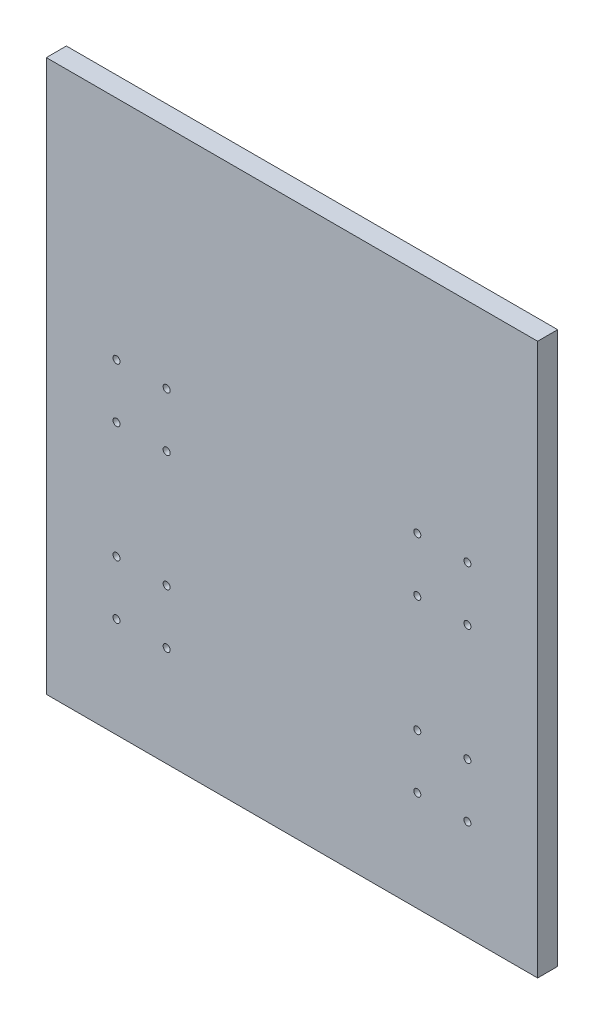
ISO-10303-21;
HEADER;
FILE_DESCRIPTION(('STEP AP214'),'2;1');
FILE_NAME('part.step','',(''),(''),'','','');
FILE_SCHEMA(('AUTOMOTIVE_DESIGN { 1 0 10303 214 1 1 1 1 }'));
ENDSEC;
DATA;
#1=APPLICATION_CONTEXT('core data for automotive mechanical design processes');
#2=APPLICATION_PROTOCOL_DEFINITION('international standard','automotive_design',2000,#1);
#3=PRODUCT_CONTEXT('',#1,'mechanical');
#4=PRODUCT('Part','Part','',(#3));
#5=PRODUCT_RELATED_PRODUCT_CATEGORY('part','',(#4));
#6=PRODUCT_DEFINITION_FORMATION('','',#4);
#7=PRODUCT_DEFINITION_CONTEXT('part definition',#1,'design');
#8=PRODUCT_DEFINITION('design','',#6,#7);
#9=PRODUCT_DEFINITION_SHAPE('','',#8);
#10=(LENGTH_UNIT() NAMED_UNIT(*) SI_UNIT(.MILLI.,.METRE.));
#11=(NAMED_UNIT(*) PLANE_ANGLE_UNIT() SI_UNIT($,.RADIAN.));
#12=(NAMED_UNIT(*) SI_UNIT($,.STERADIAN.) SOLID_ANGLE_UNIT());
#13=UNCERTAINTY_MEASURE_WITH_UNIT(LENGTH_MEASURE(1.E-05),#10,'distance_accuracy_value','');
#14=(GEOMETRIC_REPRESENTATION_CONTEXT(3) GLOBAL_UNCERTAINTY_ASSIGNED_CONTEXT((#13)) GLOBAL_UNIT_ASSIGNED_CONTEXT((#10,
#11,#12)) REPRESENTATION_CONTEXT('',''));
#15=CARTESIAN_POINT('',(0.,0.,0.));
#16=DIRECTION('',(0.,0.,1.));
#17=DIRECTION('',(1.,0.,0.));
#18=AXIS2_PLACEMENT_3D('',#15,#16,#17);
#19=CARTESIAN_POINT('',(245.,0.,20.));
#20=DIRECTION('',(1.,0.,0.));
#21=DIRECTION('',(0.,0.,-1.));
#22=AXIS2_PLACEMENT_3D('',#19,#20,#21);
#23=PLANE('',#22);
#24=DIRECTION('',(0.,-1.,0.));
#25=VECTOR('',#24,1.);
#26=CARTESIAN_POINT('',(245.,0.,0.));
#27=LINE('',#26,#25);
#28=CARTESIAN_POINT('',(245.,275.,0.));
#29=VERTEX_POINT('',#28);
#30=CARTESIAN_POINT('',(245.,-275.,0.));
#31=VERTEX_POINT('',#30);
#32=EDGE_CURVE('E154',#29,#31,#27,.T.);
#33=ORIENTED_EDGE('',*,*,#32,.F.);
#34=DIRECTION('',(0.,0.,-1.));
#35=VECTOR('',#34,1.);
#36=CARTESIAN_POINT('',(245.,275.,20.));
#37=LINE('',#36,#35);
#38=CARTESIAN_POINT('',(245.,275.,20.));
#39=VERTEX_POINT('',#38);
#40=EDGE_CURVE('E11',#39,#29,#37,.T.);
#41=ORIENTED_EDGE('',*,*,#40,.F.);
#42=DIRECTION('',(0.,-1.,0.));
#43=VECTOR('',#42,1.);
#44=CARTESIAN_POINT('',(245.,0.,20.));
#45=LINE('',#44,#43);
#46=CARTESIAN_POINT('',(245.,-275.,20.));
#47=VERTEX_POINT('',#46);
#48=EDGE_CURVE('E99',#39,#47,#45,.T.);
#49=ORIENTED_EDGE('',*,*,#48,.T.);
#50=DIRECTION('',(0.,0.,-1.));
#51=VECTOR('',#50,1.);
#52=CARTESIAN_POINT('',(245.,-275.,20.));
#53=LINE('',#52,#51);
#54=EDGE_CURVE('E77',#47,#31,#53,.T.);
#55=ORIENTED_EDGE('',*,*,#54,.T.);
#56=EDGE_LOOP('',(#33,#41,#49,#55));
#57=FACE_BOUND('',#56,.T.);
#58=ADVANCED_FACE('F37',(#57),#23,.T.);
#59=CARTESIAN_POINT('',(0.,275.,20.));
#60=DIRECTION('',(0.,1.,0.));
#61=DIRECTION('',(-1.,0.,0.));
#62=AXIS2_PLACEMENT_3D('',#59,#60,#61);
#63=PLANE('',#62);
#64=DIRECTION('',(1.,0.,0.));
#65=VECTOR('',#64,1.);
#66=CARTESIAN_POINT('',(0.,275.,0.));
#67=LINE('',#66,#65);
#68=CARTESIAN_POINT('',(-245.,275.,0.));
#69=VERTEX_POINT('',#68);
#70=EDGE_CURVE('E89',#69,#29,#67,.T.);
#71=ORIENTED_EDGE('',*,*,#70,.F.);
#72=DIRECTION('',(0.,0.,-1.));
#73=VECTOR('',#72,1.);
#74=CARTESIAN_POINT('',(-245.,275.,20.));
#75=LINE('',#74,#73);
#76=CARTESIAN_POINT('',(-245.,275.,20.));
#77=VERTEX_POINT('',#76);
#78=EDGE_CURVE('E46',#77,#69,#75,.T.);
#79=ORIENTED_EDGE('',*,*,#78,.F.);
#80=DIRECTION('',(1.,0.,0.));
#81=VECTOR('',#80,1.);
#82=CARTESIAN_POINT('',(0.,275.,20.));
#83=LINE('',#82,#81);
#84=EDGE_CURVE('E87',#77,#39,#83,.T.);
#85=ORIENTED_EDGE('',*,*,#84,.T.);
#86=ORIENTED_EDGE('',*,*,#40,.T.);
#87=EDGE_LOOP('',(#71,#79,#85,#86));
#88=FACE_BOUND('',#87,.T.);
#89=ADVANCED_FACE('F85',(#88),#63,.T.);
#90=CARTESIAN_POINT('',(-245.,0.,20.));
#91=DIRECTION('',(1.,0.,0.));
#92=DIRECTION('',(0.,0.,-1.));
#93=AXIS2_PLACEMENT_3D('',#90,#91,#92);
#94=PLANE('',#93);
#95=DIRECTION('',(0.,-1.,0.));
#96=VECTOR('',#95,1.);
#97=CARTESIAN_POINT('',(-245.,0.,0.));
#98=LINE('',#97,#96);
#99=CARTESIAN_POINT('',(-245.,-275.,0.));
#100=VERTEX_POINT('',#99);
#101=EDGE_CURVE('E157',#69,#100,#98,.T.);
#102=ORIENTED_EDGE('',*,*,#101,.T.);
#103=DIRECTION('',(0.,0.,-1.));
#104=VECTOR('',#103,1.);
#105=CARTESIAN_POINT('',(-245.,-275.,20.));
#106=LINE('',#105,#104);
#107=CARTESIAN_POINT('',(-245.,-275.,20.));
#108=VERTEX_POINT('',#107);
#109=EDGE_CURVE('E92',#108,#100,#106,.T.);
#110=ORIENTED_EDGE('',*,*,#109,.F.);
#111=DIRECTION('',(0.,-1.,0.));
#112=VECTOR('',#111,1.);
#113=CARTESIAN_POINT('',(-245.,0.,20.));
#114=LINE('',#113,#112);
#115=EDGE_CURVE('E94',#77,#108,#114,.T.);
#116=ORIENTED_EDGE('',*,*,#115,.F.);
#117=ORIENTED_EDGE('',*,*,#78,.T.);
#118=EDGE_LOOP('',(#102,#110,#116,#117));
#119=FACE_BOUND('',#118,.T.);
#120=ADVANCED_FACE('F95',(#119),#94,.F.);
#121=CARTESIAN_POINT('',(-175.,-175.,20.));
#122=DIRECTION('',(0.,0.,-1.));
#123=DIRECTION('',(-1.,0.,0.));
#124=AXIS2_PLACEMENT_3D('',#121,#122,#123);
#125=CYLINDRICAL_SURFACE('',#124,3.49999999999999);
#126=CARTESIAN_POINT('',(-175.,-175.,20.));
#127=DIRECTION('',(0.,0.,1.));
#128=DIRECTION('',(1.,0.,0.));
#129=AXIS2_PLACEMENT_3D('',#126,#127,#128);
#130=CIRCLE('',#129,3.49999999999999);
#131=CARTESIAN_POINT('',(-171.5,-175.,20.));
#132=VERTEX_POINT('',#131);
#133=EDGE_CURVE('E112',#132,#132,#130,.F.);
#134=ORIENTED_EDGE('',*,*,#133,.F.);
#135=EDGE_LOOP('',(#134));
#136=FACE_BOUND('',#135,.T.);
#137=CARTESIAN_POINT('',(-175.,-175.,0.));
#138=DIRECTION('',(0.,0.,1.));
#139=DIRECTION('',(1.,0.,0.));
#140=AXIS2_PLACEMENT_3D('',#137,#138,#139);
#141=CIRCLE('',#140,3.49999999999999);
#142=CARTESIAN_POINT('',(-171.5,-175.,0.));
#143=VERTEX_POINT('',#142);
#144=EDGE_CURVE('E166',#143,#143,#141,.F.);
#145=ORIENTED_EDGE('',*,*,#144,.T.);
#146=EDGE_LOOP('',(#145));
#147=FACE_BOUND('',#146,.T.);
#148=ADVANCED_FACE('F281',(#136,#147),#125,.F.);
#149=CARTESIAN_POINT('',(175.,49.,20.));
#150=DIRECTION('',(0.,0.,-1.));
#151=DIRECTION('',(-1.,0.,0.));
#152=AXIS2_PLACEMENT_3D('',#149,#150,#151);
#153=CYLINDRICAL_SURFACE('',#152,3.49999999999999);
#154=CARTESIAN_POINT('',(175.,49.,20.));
#155=DIRECTION('',(0.,0.,1.));
#156=DIRECTION('',(1.,0.,0.));
#157=AXIS2_PLACEMENT_3D('',#154,#155,#156);
#158=CIRCLE('',#157,3.49999999999999);
#159=CARTESIAN_POINT('',(178.5,49.,20.));
#160=VERTEX_POINT('',#159);
#161=EDGE_CURVE('E109',#160,#160,#158,.F.);
#162=ORIENTED_EDGE('',*,*,#161,.F.);
#163=EDGE_LOOP('',(#162));
#164=FACE_BOUND('',#163,.T.);
#165=CARTESIAN_POINT('',(175.,49.,0.));
#166=DIRECTION('',(0.,0.,1.));
#167=DIRECTION('',(1.,0.,0.));
#168=AXIS2_PLACEMENT_3D('',#165,#166,#167);
#169=CIRCLE('',#168,3.49999999999999);
#170=CARTESIAN_POINT('',(178.5,49.,0.));
#171=VERTEX_POINT('',#170);
#172=EDGE_CURVE('E163',#171,#171,#169,.F.);
#173=ORIENTED_EDGE('',*,*,#172,.T.);
#174=EDGE_LOOP('',(#173));
#175=FACE_BOUND('',#174,.T.);
#176=ADVANCED_FACE('F284',(#164,#175),#153,.F.);
#177=CARTESIAN_POINT('',(-125.,49.,20.));
#178=DIRECTION('',(0.,0.,-1.));
#179=DIRECTION('',(-1.,0.,0.));
#180=AXIS2_PLACEMENT_3D('',#177,#178,#179);
#181=CYLINDRICAL_SURFACE('',#180,3.50000000000001);
#182=CARTESIAN_POINT('',(-125.,49.,20.));
#183=DIRECTION('',(0.,0.,1.));
#184=DIRECTION('',(1.,0.,0.));
#185=AXIS2_PLACEMENT_3D('',#182,#183,#184);
#186=CIRCLE('',#185,3.50000000000001);
#187=CARTESIAN_POINT('',(-121.5,49.,20.));
#188=VERTEX_POINT('',#187);
#189=EDGE_CURVE('E106',#188,#188,#186,.F.);
#190=ORIENTED_EDGE('',*,*,#189,.F.);
#191=EDGE_LOOP('',(#190));
#192=FACE_BOUND('',#191,.T.);
#193=CARTESIAN_POINT('',(-125.,49.,0.));
#194=DIRECTION('',(0.,0.,1.));
#195=DIRECTION('',(1.,0.,0.));
#196=AXIS2_PLACEMENT_3D('',#193,#194,#195);
#197=CIRCLE('',#196,3.50000000000001);
#198=CARTESIAN_POINT('',(-121.5,49.,0.));
#199=VERTEX_POINT('',#198);
#200=EDGE_CURVE('E160',#199,#199,#197,.F.);
#201=ORIENTED_EDGE('',*,*,#200,.T.);
#202=EDGE_LOOP('',(#201));
#203=FACE_BOUND('',#202,.T.);
#204=ADVANCED_FACE('F288',(#192,#203),#181,.F.);
#205=CARTESIAN_POINT('',(0.,-275.,20.));
#206=DIRECTION('',(0.,1.,0.));
#207=DIRECTION('',(-1.,0.,0.));
#208=AXIS2_PLACEMENT_3D('',#205,#206,#207);
#209=PLANE('',#208);
#210=DIRECTION('',(1.,0.,0.));
#211=VECTOR('',#210,1.);
#212=CARTESIAN_POINT('',(0.,-275.,0.));
#213=LINE('',#212,#211);
#214=EDGE_CURVE('E70',#100,#31,#213,.T.);
#215=ORIENTED_EDGE('',*,*,#214,.T.);
#216=ORIENTED_EDGE('',*,*,#54,.F.);
#217=DIRECTION('',(1.,0.,0.));
#218=VECTOR('',#217,1.);
#219=CARTESIAN_POINT('',(0.,-275.,20.));
#220=LINE('',#219,#218);
#221=EDGE_CURVE('E54',#108,#47,#220,.T.);
#222=ORIENTED_EDGE('',*,*,#221,.F.);
#223=ORIENTED_EDGE('',*,*,#109,.T.);
#224=EDGE_LOOP('',(#215,#216,#222,#223));
#225=FACE_BOUND('',#224,.T.);
#226=ADVANCED_FACE('F175',(#225),#209,.F.);
#227=CARTESIAN_POINT('',(-175.,49.,20.));
#228=DIRECTION('',(0.,0.,-1.));
#229=DIRECTION('',(-1.,0.,0.));
#230=AXIS2_PLACEMENT_3D('',#227,#228,#229);
#231=CYLINDRICAL_SURFACE('',#230,3.49999999999999);
#232=CARTESIAN_POINT('',(-175.,49.,20.));
#233=DIRECTION('',(0.,0.,1.));
#234=DIRECTION('',(1.,0.,0.));
#235=AXIS2_PLACEMENT_3D('',#232,#233,#234);
#236=CIRCLE('',#235,3.49999999999999);
#237=CARTESIAN_POINT('',(-171.5,49.,20.));
#238=VERTEX_POINT('',#237);
#239=EDGE_CURVE('E101',#238,#238,#236,.T.);
#240=ORIENTED_EDGE('',*,*,#239,.T.);
#241=EDGE_LOOP('',(#240));
#242=FACE_BOUND('',#241,.T.);
#243=CARTESIAN_POINT('',(-175.,49.,0.));
#244=DIRECTION('',(0.,0.,1.));
#245=DIRECTION('',(1.,0.,0.));
#246=AXIS2_PLACEMENT_3D('',#243,#244,#245);
#247=CIRCLE('',#246,3.49999999999999);
#248=CARTESIAN_POINT('',(-171.5,49.,0.));
#249=VERTEX_POINT('',#248);
#250=EDGE_CURVE('E151',#249,#249,#247,.T.);
#251=ORIENTED_EDGE('',*,*,#250,.F.);
#252=EDGE_LOOP('',(#251));
#253=FACE_BOUND('',#252,.T.);
#254=ADVANCED_FACE('F186',(#242,#253),#231,.F.);
#255=CARTESIAN_POINT('',(-175.,-5.,20.));
#256=DIRECTION('',(0.,0.,-1.));
#257=DIRECTION('',(-1.,0.,0.));
#258=AXIS2_PLACEMENT_3D('',#255,#256,#257);
#259=CYLINDRICAL_SURFACE('',#258,3.49999999999999);
#260=CARTESIAN_POINT('',(-175.,-5.,20.));
#261=DIRECTION('',(0.,0.,1.));
#262=DIRECTION('',(1.,0.,0.));
#263=AXIS2_PLACEMENT_3D('',#260,#261,#262);
#264=CIRCLE('',#263,3.49999999999999);
#265=CARTESIAN_POINT('',(-171.5,-5.,20.));
#266=VERTEX_POINT('',#265);
#267=EDGE_CURVE('E486',#266,#266,#264,.T.);
#268=ORIENTED_EDGE('',*,*,#267,.T.);
#269=EDGE_LOOP('',(#268));
#270=FACE_BOUND('',#269,.T.);
#271=CARTESIAN_POINT('',(-175.,-5.,0.));
#272=DIRECTION('',(0.,0.,1.));
#273=DIRECTION('',(1.,0.,0.));
#274=AXIS2_PLACEMENT_3D('',#271,#272,#273);
#275=CIRCLE('',#274,3.49999999999999);
#276=CARTESIAN_POINT('',(-171.5,-5.,0.));
#277=VERTEX_POINT('',#276);
#278=EDGE_CURVE('E148',#277,#277,#275,.T.);
#279=ORIENTED_EDGE('',*,*,#278,.F.);
#280=EDGE_LOOP('',(#279));
#281=FACE_BOUND('',#280,.T.);
#282=ADVANCED_FACE('F189',(#270,#281),#259,.F.);
#283=CARTESIAN_POINT('',(-125.,-5.00000000000001,20.));
#284=DIRECTION('',(0.,0.,-1.));
#285=DIRECTION('',(-1.,0.,0.));
#286=AXIS2_PLACEMENT_3D('',#283,#284,#285);
#287=CYLINDRICAL_SURFACE('',#286,3.50000000000001);
#288=CARTESIAN_POINT('',(-125.,-5.00000000000001,20.));
#289=DIRECTION('',(0.,0.,1.));
#290=DIRECTION('',(1.,0.,0.));
#291=AXIS2_PLACEMENT_3D('',#288,#289,#290);
#292=CIRCLE('',#291,3.50000000000001);
#293=CARTESIAN_POINT('',(-121.5,-5.00000000000001,20.));
#294=VERTEX_POINT('',#293);
#295=EDGE_CURVE('E482',#294,#294,#292,.F.);
#296=ORIENTED_EDGE('',*,*,#295,.F.);
#297=EDGE_LOOP('',(#296));
#298=FACE_BOUND('',#297,.T.);
#299=CARTESIAN_POINT('',(-125.,-5.00000000000001,0.));
#300=DIRECTION('',(0.,0.,1.));
#301=DIRECTION('',(1.,0.,0.));
#302=AXIS2_PLACEMENT_3D('',#299,#300,#301);
#303=CIRCLE('',#302,3.50000000000001);
#304=CARTESIAN_POINT('',(-121.5,-5.00000000000001,0.));
#305=VERTEX_POINT('',#304);
#306=EDGE_CURVE('E145',#305,#305,#303,.F.);
#307=ORIENTED_EDGE('',*,*,#306,.T.);
#308=EDGE_LOOP('',(#307));
#309=FACE_BOUND('',#308,.T.);
#310=ADVANCED_FACE('F193',(#298,#309),#287,.F.);
#311=CARTESIAN_POINT('',(125.,49.,20.));
#312=DIRECTION('',(0.,0.,-1.));
#313=DIRECTION('',(-1.,0.,0.));
#314=AXIS2_PLACEMENT_3D('',#311,#312,#313);
#315=CYLINDRICAL_SURFACE('',#314,3.49999999999999);
#316=CARTESIAN_POINT('',(125.,49.,20.));
#317=DIRECTION('',(0.,0.,1.));
#318=DIRECTION('',(1.,0.,0.));
#319=AXIS2_PLACEMENT_3D('',#316,#317,#318);
#320=CIRCLE('',#319,3.49999999999999);
#321=CARTESIAN_POINT('',(128.5,49.,20.));
#322=VERTEX_POINT('',#321);
#323=EDGE_CURVE('E478',#322,#322,#320,.T.);
#324=ORIENTED_EDGE('',*,*,#323,.T.);
#325=EDGE_LOOP('',(#324));
#326=FACE_BOUND('',#325,.T.);
#327=CARTESIAN_POINT('',(125.,49.,0.));
#328=DIRECTION('',(0.,0.,1.));
#329=DIRECTION('',(1.,0.,0.));
#330=AXIS2_PLACEMENT_3D('',#327,#328,#329);
#331=CIRCLE('',#330,3.49999999999999);
#332=CARTESIAN_POINT('',(128.5,49.,0.));
#333=VERTEX_POINT('',#332);
#334=EDGE_CURVE('E142',#333,#333,#331,.T.);
#335=ORIENTED_EDGE('',*,*,#334,.F.);
#336=EDGE_LOOP('',(#335));
#337=FACE_BOUND('',#336,.T.);
#338=ADVANCED_FACE('F197',(#326,#337),#315,.F.);
#339=CARTESIAN_POINT('',(125.,-4.99999999999998,20.));
#340=DIRECTION('',(0.,0.,-1.));
#341=DIRECTION('',(-1.,0.,0.));
#342=AXIS2_PLACEMENT_3D('',#339,#340,#341);
#343=CYLINDRICAL_SURFACE('',#342,3.49999999999999);
#344=CARTESIAN_POINT('',(125.,-4.99999999999998,20.));
#345=DIRECTION('',(0.,0.,1.));
#346=DIRECTION('',(1.,0.,0.));
#347=AXIS2_PLACEMENT_3D('',#344,#345,#346);
#348=CIRCLE('',#347,3.49999999999999);
#349=CARTESIAN_POINT('',(128.5,-4.99999999999998,20.));
#350=VERTEX_POINT('',#349);
#351=EDGE_CURVE('E474',#350,#350,#348,.T.);
#352=ORIENTED_EDGE('',*,*,#351,.T.);
#353=EDGE_LOOP('',(#352));
#354=FACE_BOUND('',#353,.T.);
#355=CARTESIAN_POINT('',(125.,-4.99999999999998,0.));
#356=DIRECTION('',(0.,0.,1.));
#357=DIRECTION('',(1.,0.,0.));
#358=AXIS2_PLACEMENT_3D('',#355,#356,#357);
#359=CIRCLE('',#358,3.49999999999999);
#360=CARTESIAN_POINT('',(128.5,-4.99999999999998,0.));
#361=VERTEX_POINT('',#360);
#362=EDGE_CURVE('E139',#361,#361,#359,.T.);
#363=ORIENTED_EDGE('',*,*,#362,.F.);
#364=EDGE_LOOP('',(#363));
#365=FACE_BOUND('',#364,.T.);
#366=ADVANCED_FACE('F201',(#354,#365),#343,.F.);
#367=CARTESIAN_POINT('',(175.,-4.99999999999996,20.));
#368=DIRECTION('',(0.,0.,-1.));
#369=DIRECTION('',(-1.,0.,0.));
#370=AXIS2_PLACEMENT_3D('',#367,#368,#369);
#371=CYLINDRICAL_SURFACE('',#370,3.49999999999999);
#372=CARTESIAN_POINT('',(175.,-4.99999999999996,20.));
#373=DIRECTION('',(0.,0.,1.));
#374=DIRECTION('',(1.,0.,0.));
#375=AXIS2_PLACEMENT_3D('',#372,#373,#374);
#376=CIRCLE('',#375,3.49999999999999);
#377=CARTESIAN_POINT('',(178.5,-4.99999999999996,20.));
#378=VERTEX_POINT('',#377);
#379=EDGE_CURVE('E470',#378,#378,#376,.F.);
#380=ORIENTED_EDGE('',*,*,#379,.F.);
#381=EDGE_LOOP('',(#380));
#382=FACE_BOUND('',#381,.T.);
#383=CARTESIAN_POINT('',(175.,-4.99999999999996,0.));
#384=DIRECTION('',(0.,0.,1.));
#385=DIRECTION('',(1.,0.,0.));
#386=AXIS2_PLACEMENT_3D('',#383,#384,#385);
#387=CIRCLE('',#386,3.49999999999999);
#388=CARTESIAN_POINT('',(178.5,-4.99999999999996,0.));
#389=VERTEX_POINT('',#388);
#390=EDGE_CURVE('E136',#389,#389,#387,.F.);
#391=ORIENTED_EDGE('',*,*,#390,.T.);
#392=EDGE_LOOP('',(#391));
#393=FACE_BOUND('',#392,.T.);
#394=ADVANCED_FACE('F205',(#382,#393),#371,.F.);
#395=CARTESIAN_POINT('',(-175.,-121.,20.));
#396=DIRECTION('',(0.,0.,-1.));
#397=DIRECTION('',(-1.,0.,0.));
#398=AXIS2_PLACEMENT_3D('',#395,#396,#397);
#399=CYLINDRICAL_SURFACE('',#398,3.49999999999999);
#400=CARTESIAN_POINT('',(-175.,-121.,20.));
#401=DIRECTION('',(0.,0.,1.));
#402=DIRECTION('',(1.,0.,0.));
#403=AXIS2_PLACEMENT_3D('',#400,#401,#402);
#404=CIRCLE('',#403,3.49999999999999);
#405=CARTESIAN_POINT('',(-171.5,-121.,20.));
#406=VERTEX_POINT('',#405);
#407=EDGE_CURVE('E466',#406,#406,#404,.F.);
#408=ORIENTED_EDGE('',*,*,#407,.F.);
#409=EDGE_LOOP('',(#408));
#410=FACE_BOUND('',#409,.T.);
#411=CARTESIAN_POINT('',(-175.,-121.,0.));
#412=DIRECTION('',(0.,0.,1.));
#413=DIRECTION('',(1.,0.,0.));
#414=AXIS2_PLACEMENT_3D('',#411,#412,#413);
#415=CIRCLE('',#414,3.49999999999999);
#416=CARTESIAN_POINT('',(-171.5,-121.,0.));
#417=VERTEX_POINT('',#416);
#418=EDGE_CURVE('E133',#417,#417,#415,.F.);
#419=ORIENTED_EDGE('',*,*,#418,.T.);
#420=EDGE_LOOP('',(#419));
#421=FACE_BOUND('',#420,.T.);
#422=ADVANCED_FACE('F209',(#410,#421),#399,.F.);
#423=CARTESIAN_POINT('',(-125.,-175.,20.));
#424=DIRECTION('',(0.,0.,-1.));
#425=DIRECTION('',(-1.,0.,0.));
#426=AXIS2_PLACEMENT_3D('',#423,#424,#425);
#427=CYLINDRICAL_SURFACE('',#426,3.50000000000001);
#428=CARTESIAN_POINT('',(-125.,-175.,20.));
#429=DIRECTION('',(0.,0.,1.));
#430=DIRECTION('',(1.,0.,0.));
#431=AXIS2_PLACEMENT_3D('',#428,#429,#430);
#432=CIRCLE('',#431,3.50000000000001);
#433=CARTESIAN_POINT('',(-121.5,-175.,20.));
#434=VERTEX_POINT('',#433);
#435=EDGE_CURVE('E462',#434,#434,#432,.T.);
#436=ORIENTED_EDGE('',*,*,#435,.T.);
#437=EDGE_LOOP('',(#436));
#438=FACE_BOUND('',#437,.T.);
#439=CARTESIAN_POINT('',(-125.,-175.,0.));
#440=DIRECTION('',(0.,0.,1.));
#441=DIRECTION('',(1.,0.,0.));
#442=AXIS2_PLACEMENT_3D('',#439,#440,#441);
#443=CIRCLE('',#442,3.50000000000001);
#444=CARTESIAN_POINT('',(-121.5,-175.,0.));
#445=VERTEX_POINT('',#444);
#446=EDGE_CURVE('E130',#445,#445,#443,.T.);
#447=ORIENTED_EDGE('',*,*,#446,.F.);
#448=EDGE_LOOP('',(#447));
#449=FACE_BOUND('',#448,.T.);
#450=ADVANCED_FACE('F213',(#438,#449),#427,.F.);
#451=CARTESIAN_POINT('',(-125.,-121.,20.));
#452=DIRECTION('',(0.,0.,-1.));
#453=DIRECTION('',(-1.,0.,0.));
#454=AXIS2_PLACEMENT_3D('',#451,#452,#453);
#455=CYLINDRICAL_SURFACE('',#454,3.50000000000001);
#456=CARTESIAN_POINT('',(-125.,-121.,20.));
#457=DIRECTION('',(0.,0.,1.));
#458=DIRECTION('',(1.,0.,0.));
#459=AXIS2_PLACEMENT_3D('',#456,#457,#458);
#460=CIRCLE('',#459,3.50000000000001);
#461=CARTESIAN_POINT('',(-121.5,-121.,20.));
#462=VERTEX_POINT('',#461);
#463=EDGE_CURVE('E458',#462,#462,#460,.T.);
#464=ORIENTED_EDGE('',*,*,#463,.T.);
#465=EDGE_LOOP('',(#464));
#466=FACE_BOUND('',#465,.T.);
#467=CARTESIAN_POINT('',(-125.,-121.,0.));
#468=DIRECTION('',(0.,0.,1.));
#469=DIRECTION('',(1.,0.,0.));
#470=AXIS2_PLACEMENT_3D('',#467,#468,#469);
#471=CIRCLE('',#470,3.50000000000001);
#472=CARTESIAN_POINT('',(-121.5,-121.,0.));
#473=VERTEX_POINT('',#472);
#474=EDGE_CURVE('E127',#473,#473,#471,.T.);
#475=ORIENTED_EDGE('',*,*,#474,.F.);
#476=EDGE_LOOP('',(#475));
#477=FACE_BOUND('',#476,.T.);
#478=ADVANCED_FACE('F217',(#466,#477),#455,.F.);
#479=CARTESIAN_POINT('',(125.,-121.,20.));
#480=DIRECTION('',(0.,0.,-1.));
#481=DIRECTION('',(-1.,0.,0.));
#482=AXIS2_PLACEMENT_3D('',#479,#480,#481);
#483=CYLINDRICAL_SURFACE('',#482,3.49999999999999);
#484=CARTESIAN_POINT('',(125.,-121.,20.));
#485=DIRECTION('',(0.,0.,1.));
#486=DIRECTION('',(1.,0.,0.));
#487=AXIS2_PLACEMENT_3D('',#484,#485,#486);
#488=CIRCLE('',#487,3.49999999999999);
#489=CARTESIAN_POINT('',(128.5,-121.,20.));
#490=VERTEX_POINT('',#489);
#491=EDGE_CURVE('E454',#490,#490,#488,.F.);
#492=ORIENTED_EDGE('',*,*,#491,.F.);
#493=EDGE_LOOP('',(#492));
#494=FACE_BOUND('',#493,.T.);
#495=CARTESIAN_POINT('',(125.,-121.,0.));
#496=DIRECTION('',(0.,0.,1.));
#497=DIRECTION('',(1.,0.,0.));
#498=AXIS2_PLACEMENT_3D('',#495,#496,#497);
#499=CIRCLE('',#498,3.49999999999999);
#500=CARTESIAN_POINT('',(128.5,-121.,0.));
#501=VERTEX_POINT('',#500);
#502=EDGE_CURVE('E124',#501,#501,#499,.F.);
#503=ORIENTED_EDGE('',*,*,#502,.T.);
#504=EDGE_LOOP('',(#503));
#505=FACE_BOUND('',#504,.T.);
#506=ADVANCED_FACE('F221',(#494,#505),#483,.F.);
#507=CARTESIAN_POINT('',(175.,-175.,20.));
#508=DIRECTION('',(0.,0.,-1.));
#509=DIRECTION('',(-1.,0.,0.));
#510=AXIS2_PLACEMENT_3D('',#507,#508,#509);
#511=CYLINDRICAL_SURFACE('',#510,3.49999999999999);
#512=CARTESIAN_POINT('',(175.,-175.,20.));
#513=DIRECTION('',(0.,0.,1.));
#514=DIRECTION('',(1.,0.,0.));
#515=AXIS2_PLACEMENT_3D('',#512,#513,#514);
#516=CIRCLE('',#515,3.49999999999999);
#517=CARTESIAN_POINT('',(178.5,-175.,20.));
#518=VERTEX_POINT('',#517);
#519=EDGE_CURVE('E236',#518,#518,#516,.T.);
#520=ORIENTED_EDGE('',*,*,#519,.T.);
#521=EDGE_LOOP('',(#520));
#522=FACE_BOUND('',#521,.T.);
#523=CARTESIAN_POINT('',(175.,-175.,0.));
#524=DIRECTION('',(0.,0.,1.));
#525=DIRECTION('',(1.,0.,0.));
#526=AXIS2_PLACEMENT_3D('',#523,#524,#525);
#527=CIRCLE('',#526,3.49999999999999);
#528=CARTESIAN_POINT('',(178.5,-175.,0.));
#529=VERTEX_POINT('',#528);
#530=EDGE_CURVE('E121',#529,#529,#527,.T.);
#531=ORIENTED_EDGE('',*,*,#530,.F.);
#532=EDGE_LOOP('',(#531));
#533=FACE_BOUND('',#532,.T.);
#534=ADVANCED_FACE('F224',(#522,#533),#511,.F.);
#535=CARTESIAN_POINT('',(175.,-121.,20.));
#536=DIRECTION('',(0.,0.,-1.));
#537=DIRECTION('',(-1.,0.,0.));
#538=AXIS2_PLACEMENT_3D('',#535,#536,#537);
#539=CYLINDRICAL_SURFACE('',#538,3.49999999999999);
#540=CARTESIAN_POINT('',(175.,-121.,20.));
#541=DIRECTION('',(0.,0.,1.));
#542=DIRECTION('',(1.,0.,0.));
#543=AXIS2_PLACEMENT_3D('',#540,#541,#542);
#544=CIRCLE('',#543,3.49999999999999);
#545=CARTESIAN_POINT('',(178.5,-121.,20.));
#546=VERTEX_POINT('',#545);
#547=EDGE_CURVE('E172',#546,#546,#544,.T.);
#548=ORIENTED_EDGE('',*,*,#547,.T.);
#549=EDGE_LOOP('',(#548));
#550=FACE_BOUND('',#549,.T.);
#551=CARTESIAN_POINT('',(175.,-121.,0.));
#552=DIRECTION('',(0.,0.,1.));
#553=DIRECTION('',(1.,0.,0.));
#554=AXIS2_PLACEMENT_3D('',#551,#552,#553);
#555=CIRCLE('',#554,3.49999999999999);
#556=CARTESIAN_POINT('',(178.5,-121.,0.));
#557=VERTEX_POINT('',#556);
#558=EDGE_CURVE('E118',#557,#557,#555,.T.);
#559=ORIENTED_EDGE('',*,*,#558,.F.);
#560=EDGE_LOOP('',(#559));
#561=FACE_BOUND('',#560,.T.);
#562=ADVANCED_FACE('F39',(#550,#561),#539,.F.);
#563=CARTESIAN_POINT('',(125.,-175.,20.));
#564=DIRECTION('',(0.,0.,-1.));
#565=DIRECTION('',(-1.,0.,0.));
#566=AXIS2_PLACEMENT_3D('',#563,#564,#565);
#567=CYLINDRICAL_SURFACE('',#566,3.49999999999999);
#568=CARTESIAN_POINT('',(125.,-175.,20.));
#569=DIRECTION('',(0.,0.,1.));
#570=DIRECTION('',(1.,0.,0.));
#571=AXIS2_PLACEMENT_3D('',#568,#569,#570);
#572=CIRCLE('',#571,3.49999999999999);
#573=CARTESIAN_POINT('',(128.5,-175.,20.));
#574=VERTEX_POINT('',#573);
#575=EDGE_CURVE('E115',#574,#574,#572,.F.);
#576=ORIENTED_EDGE('',*,*,#575,.F.);
#577=EDGE_LOOP('',(#576));
#578=FACE_BOUND('',#577,.T.);
#579=CARTESIAN_POINT('',(125.,-175.,0.));
#580=DIRECTION('',(0.,0.,1.));
#581=DIRECTION('',(1.,0.,0.));
#582=AXIS2_PLACEMENT_3D('',#579,#580,#581);
#583=CIRCLE('',#582,3.49999999999999);
#584=CARTESIAN_POINT('',(128.5,-175.,0.));
#585=VERTEX_POINT('',#584);
#586=EDGE_CURVE('E169',#585,#585,#583,.F.);
#587=ORIENTED_EDGE('',*,*,#586,.T.);
#588=EDGE_LOOP('',(#587));
#589=FACE_BOUND('',#588,.T.);
#590=ADVANCED_FACE('F231',(#578,#589),#567,.F.);
#591=CARTESIAN_POINT('',(0.,0.,20.));
#592=DIRECTION('',(0.,0.,1.));
#593=DIRECTION('',(1.,0.,0.));
#594=AXIS2_PLACEMENT_3D('',#591,#592,#593);
#595=PLANE('',#594);
#596=ORIENTED_EDGE('',*,*,#547,.F.);
#597=EDGE_LOOP('',(#596));
#598=FACE_BOUND('',#597,.T.);
#599=ORIENTED_EDGE('',*,*,#519,.F.);
#600=EDGE_LOOP('',(#599));
#601=FACE_BOUND('',#600,.T.);
#602=ORIENTED_EDGE('',*,*,#491,.T.);
#603=EDGE_LOOP('',(#602));
#604=FACE_BOUND('',#603,.T.);
#605=ORIENTED_EDGE('',*,*,#463,.F.);
#606=EDGE_LOOP('',(#605));
#607=FACE_BOUND('',#606,.T.);
#608=ORIENTED_EDGE('',*,*,#435,.F.);
#609=EDGE_LOOP('',(#608));
#610=FACE_BOUND('',#609,.T.);
#611=ORIENTED_EDGE('',*,*,#407,.T.);
#612=EDGE_LOOP('',(#611));
#613=FACE_BOUND('',#612,.T.);
#614=ORIENTED_EDGE('',*,*,#379,.T.);
#615=EDGE_LOOP('',(#614));
#616=FACE_BOUND('',#615,.T.);
#617=ORIENTED_EDGE('',*,*,#351,.F.);
#618=EDGE_LOOP('',(#617));
#619=FACE_BOUND('',#618,.T.);
#620=ORIENTED_EDGE('',*,*,#323,.F.);
#621=EDGE_LOOP('',(#620));
#622=FACE_BOUND('',#621,.T.);
#623=ORIENTED_EDGE('',*,*,#295,.T.);
#624=EDGE_LOOP('',(#623));
#625=FACE_BOUND('',#624,.T.);
#626=ORIENTED_EDGE('',*,*,#267,.F.);
#627=EDGE_LOOP('',(#626));
#628=FACE_BOUND('',#627,.T.);
#629=ORIENTED_EDGE('',*,*,#239,.F.);
#630=EDGE_LOOP('',(#629));
#631=FACE_BOUND('',#630,.T.);
#632=ORIENTED_EDGE('',*,*,#48,.F.);
#633=ORIENTED_EDGE('',*,*,#84,.F.);
#634=ORIENTED_EDGE('',*,*,#115,.T.);
#635=ORIENTED_EDGE('',*,*,#221,.T.);
#636=EDGE_LOOP('',(#632,#633,#634,#635));
#637=FACE_BOUND('',#636,.T.);
#638=ORIENTED_EDGE('',*,*,#189,.T.);
#639=EDGE_LOOP('',(#638));
#640=FACE_BOUND('',#639,.T.);
#641=ORIENTED_EDGE('',*,*,#161,.T.);
#642=EDGE_LOOP('',(#641));
#643=FACE_BOUND('',#642,.T.);
#644=ORIENTED_EDGE('',*,*,#133,.T.);
#645=EDGE_LOOP('',(#644));
#646=FACE_BOUND('',#645,.T.);
#647=ORIENTED_EDGE('',*,*,#575,.T.);
#648=EDGE_LOOP('',(#647));
#649=FACE_BOUND('',#648,.T.);
#650=ADVANCED_FACE('F97',(#598,#601,#604,#607,#610,#613,#616,#619,#622,#625,#628,#631,#637,#640,
#643,#646,#649),#595,.T.);
#651=CARTESIAN_POINT('',(0.,0.,0.));
#652=DIRECTION('',(0.,0.,1.));
#653=DIRECTION('',(1.,0.,0.));
#654=AXIS2_PLACEMENT_3D('',#651,#652,#653);
#655=PLANE('',#654);
#656=ORIENTED_EDGE('',*,*,#558,.T.);
#657=EDGE_LOOP('',(#656));
#658=FACE_BOUND('',#657,.T.);
#659=ORIENTED_EDGE('',*,*,#530,.T.);
#660=EDGE_LOOP('',(#659));
#661=FACE_BOUND('',#660,.T.);
#662=ORIENTED_EDGE('',*,*,#502,.F.);
#663=EDGE_LOOP('',(#662));
#664=FACE_BOUND('',#663,.T.);
#665=ORIENTED_EDGE('',*,*,#474,.T.);
#666=EDGE_LOOP('',(#665));
#667=FACE_BOUND('',#666,.T.);
#668=ORIENTED_EDGE('',*,*,#446,.T.);
#669=EDGE_LOOP('',(#668));
#670=FACE_BOUND('',#669,.T.);
#671=ORIENTED_EDGE('',*,*,#418,.F.);
#672=EDGE_LOOP('',(#671));
#673=FACE_BOUND('',#672,.T.);
#674=ORIENTED_EDGE('',*,*,#390,.F.);
#675=EDGE_LOOP('',(#674));
#676=FACE_BOUND('',#675,.T.);
#677=ORIENTED_EDGE('',*,*,#362,.T.);
#678=EDGE_LOOP('',(#677));
#679=FACE_BOUND('',#678,.T.);
#680=ORIENTED_EDGE('',*,*,#334,.T.);
#681=EDGE_LOOP('',(#680));
#682=FACE_BOUND('',#681,.T.);
#683=ORIENTED_EDGE('',*,*,#306,.F.);
#684=EDGE_LOOP('',(#683));
#685=FACE_BOUND('',#684,.T.);
#686=ORIENTED_EDGE('',*,*,#278,.T.);
#687=EDGE_LOOP('',(#686));
#688=FACE_BOUND('',#687,.T.);
#689=ORIENTED_EDGE('',*,*,#250,.T.);
#690=EDGE_LOOP('',(#689));
#691=FACE_BOUND('',#690,.T.);
#692=ORIENTED_EDGE('',*,*,#32,.T.);
#693=ORIENTED_EDGE('',*,*,#214,.F.);
#694=ORIENTED_EDGE('',*,*,#101,.F.);
#695=ORIENTED_EDGE('',*,*,#70,.T.);
#696=EDGE_LOOP('',(#692,#693,#694,#695));
#697=FACE_BOUND('',#696,.T.);
#698=ORIENTED_EDGE('',*,*,#200,.F.);
#699=EDGE_LOOP('',(#698));
#700=FACE_BOUND('',#699,.T.);
#701=ORIENTED_EDGE('',*,*,#172,.F.);
#702=EDGE_LOOP('',(#701));
#703=FACE_BOUND('',#702,.T.);
#704=ORIENTED_EDGE('',*,*,#144,.F.);
#705=EDGE_LOOP('',(#704));
#706=FACE_BOUND('',#705,.T.);
#707=ORIENTED_EDGE('',*,*,#586,.F.);
#708=EDGE_LOOP('',(#707));
#709=FACE_BOUND('',#708,.T.);
#710=ADVANCED_FACE('F176',(#658,#661,#664,#667,#670,#673,#676,#679,#682,#685,#688,#691,#697,
#700,#703,#706,#709),#655,.F.);
#711=CLOSED_SHELL('',(#58,#89,#120,#148,#176,#204,#226,#254,#282,#310,#338,#366,#394,#422,#450,
#478,#506,#534,#562,#590,#650,#710));
#712=MANIFOLD_SOLID_BREP('B2',#711);
#713=ADVANCED_BREP_SHAPE_REPRESENTATION('',(#18,#712),#14);
#714=SHAPE_DEFINITION_REPRESENTATION(#9,#713);
ENDSEC;
END-ISO-10303-21;
